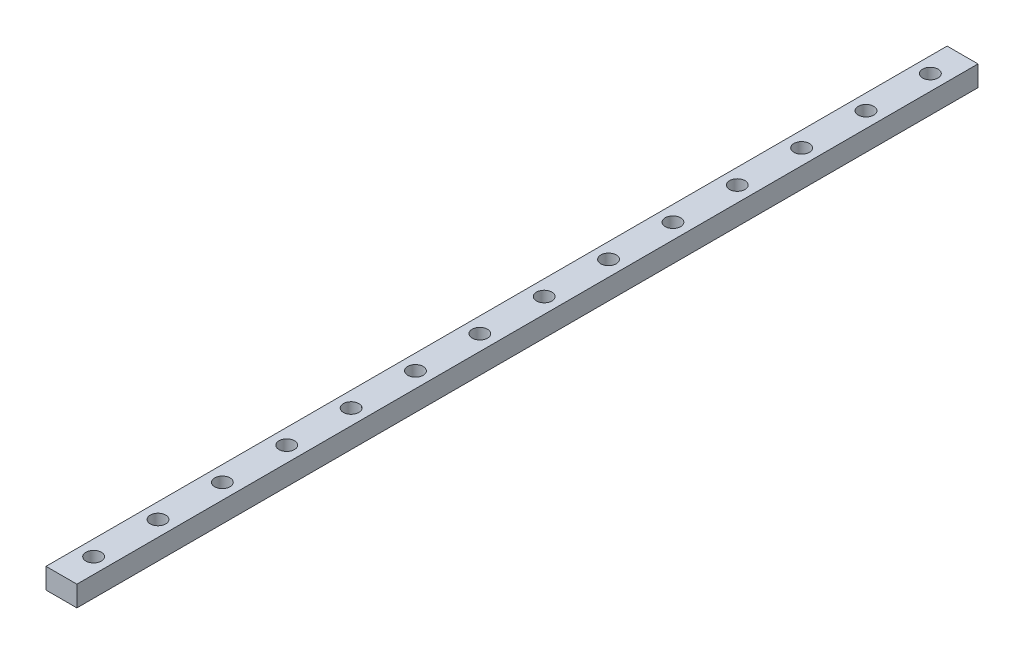
ISO-10303-21;
HEADER;
FILE_DESCRIPTION(('STEP AP214'),'2;1');
FILE_NAME('part.step','',(''),(''),'','','');
FILE_SCHEMA(('AUTOMOTIVE_DESIGN { 1 0 10303 214 1 1 1 1 }'));
ENDSEC;
DATA;
#1=APPLICATION_CONTEXT('core data for automotive mechanical design processes');
#2=APPLICATION_PROTOCOL_DEFINITION('international standard','automotive_design',2000,#1);
#3=PRODUCT_CONTEXT('',#1,'mechanical');
#4=PRODUCT('Part','Part','',(#3));
#5=PRODUCT_RELATED_PRODUCT_CATEGORY('part','',(#4));
#6=PRODUCT_DEFINITION_FORMATION('','',#4);
#7=PRODUCT_DEFINITION_CONTEXT('part definition',#1,'design');
#8=PRODUCT_DEFINITION('design','',#6,#7);
#9=PRODUCT_DEFINITION_SHAPE('','',#8);
#10=(LENGTH_UNIT() NAMED_UNIT(*) SI_UNIT(.MILLI.,.METRE.));
#11=(NAMED_UNIT(*) PLANE_ANGLE_UNIT() SI_UNIT($,.RADIAN.));
#12=(NAMED_UNIT(*) SI_UNIT($,.STERADIAN.) SOLID_ANGLE_UNIT());
#13=UNCERTAINTY_MEASURE_WITH_UNIT(LENGTH_MEASURE(1.E-05),#10,'distance_accuracy_value','');
#14=(GEOMETRIC_REPRESENTATION_CONTEXT(3) GLOBAL_UNCERTAINTY_ASSIGNED_CONTEXT((#13)) GLOBAL_UNIT_ASSIGNED_CONTEXT((#10,
#11,#12)) REPRESENTATION_CONTEXT('',''));
#15=CARTESIAN_POINT('',(0.,0.,0.));
#16=DIRECTION('',(0.,0.,1.));
#17=DIRECTION('',(1.,0.,0.));
#18=AXIS2_PLACEMENT_3D('',#15,#16,#17);
#19=CARTESIAN_POINT('',(0.,0.,350.));
#20=DIRECTION('',(1.,0.,0.));
#21=DIRECTION('',(0.,1.,0.));
#22=AXIS2_PLACEMENT_3D('',#19,#20,#21);
#23=PLANE('',#22);
#24=DIRECTION('',(0.,-1.,0.));
#25=VECTOR('',#24,1.);
#26=CARTESIAN_POINT('',(0.,0.,0.));
#27=LINE('',#26,#25);
#28=CARTESIAN_POINT('',(0.,8.,0.));
#29=VERTEX_POINT('',#28);
#30=CARTESIAN_POINT('',(0.,0.,0.));
#31=VERTEX_POINT('',#30);
#32=EDGE_CURVE('E107',#29,#31,#27,.T.);
#33=ORIENTED_EDGE('',*,*,#32,.T.);
#34=DIRECTION('',(0.,0.,-1.));
#35=VECTOR('',#34,1.);
#36=CARTESIAN_POINT('',(0.,0.,350.));
#37=LINE('',#36,#35);
#38=CARTESIAN_POINT('',(0.,0.,350.));
#39=VERTEX_POINT('',#38);
#40=EDGE_CURVE('E11',#39,#31,#37,.T.);
#41=ORIENTED_EDGE('',*,*,#40,.F.);
#42=DIRECTION('',(0.,-1.,0.));
#43=VECTOR('',#42,1.);
#44=CARTESIAN_POINT('',(0.,0.,350.));
#45=LINE('',#44,#43);
#46=CARTESIAN_POINT('',(0.,8.,350.));
#47=VERTEX_POINT('',#46);
#48=EDGE_CURVE('E94',#47,#39,#45,.T.);
#49=ORIENTED_EDGE('',*,*,#48,.F.);
#50=DIRECTION('',(0.,0.,-1.));
#51=VECTOR('',#50,1.);
#52=CARTESIAN_POINT('',(0.,8.,350.));
#53=LINE('',#52,#51);
#54=EDGE_CURVE('E103',#47,#29,#53,.T.);
#55=ORIENTED_EDGE('',*,*,#54,.T.);
#56=EDGE_LOOP('',(#33,#41,#49,#55));
#57=FACE_BOUND('',#56,.T.);
#58=ADVANCED_FACE('F41',(#57),#23,.F.);
#59=CARTESIAN_POINT('',(0.,0.,350.));
#60=DIRECTION('',(0.,1.,0.));
#61=DIRECTION('',(0.,0.,1.));
#62=AXIS2_PLACEMENT_3D('',#59,#60,#61);
#63=PLANE('',#62);
#64=CARTESIAN_POINT('',(6.,0.,37.5));
#65=DIRECTION('',(0.,-1.,0.));
#66=DIRECTION('',(0.,0.,-1.));
#67=AXIS2_PLACEMENT_3D('',#64,#65,#66);
#68=CIRCLE('',#67,1.75);
#69=CARTESIAN_POINT('',(6.,0.,35.75));
#70=VERTEX_POINT('',#69);
#71=EDGE_CURVE('E125',#70,#70,#68,.T.);
#72=ORIENTED_EDGE('',*,*,#71,.F.);
#73=EDGE_LOOP('',(#72));
#74=FACE_BOUND('',#73,.T.);
#75=CARTESIAN_POINT('',(6.,0.,62.5));
#76=DIRECTION('',(0.,-1.,0.));
#77=DIRECTION('',(0.,0.,-1.));
#78=AXIS2_PLACEMENT_3D('',#75,#76,#77);
#79=CIRCLE('',#78,1.75);
#80=CARTESIAN_POINT('',(6.,0.,60.75));
#81=VERTEX_POINT('',#80);
#82=EDGE_CURVE('E378',#81,#81,#79,.T.);
#83=ORIENTED_EDGE('',*,*,#82,.F.);
#84=EDGE_LOOP('',(#83));
#85=FACE_BOUND('',#84,.T.);
#86=CARTESIAN_POINT('',(6.,0.,87.5));
#87=DIRECTION('',(0.,-1.,0.));
#88=DIRECTION('',(0.,0.,-1.));
#89=AXIS2_PLACEMENT_3D('',#86,#87,#88);
#90=CIRCLE('',#89,1.75);
#91=CARTESIAN_POINT('',(6.,0.,85.75));
#92=VERTEX_POINT('',#91);
#93=EDGE_CURVE('E381',#92,#92,#90,.T.);
#94=ORIENTED_EDGE('',*,*,#93,.F.);
#95=EDGE_LOOP('',(#94));
#96=FACE_BOUND('',#95,.T.);
#97=CARTESIAN_POINT('',(6.,0.,112.5));
#98=DIRECTION('',(0.,-1.,0.));
#99=DIRECTION('',(0.,0.,-1.));
#100=AXIS2_PLACEMENT_3D('',#97,#98,#99);
#101=CIRCLE('',#100,1.75);
#102=CARTESIAN_POINT('',(6.,0.,110.75));
#103=VERTEX_POINT('',#102);
#104=EDGE_CURVE('E386',#103,#103,#101,.T.);
#105=ORIENTED_EDGE('',*,*,#104,.F.);
#106=EDGE_LOOP('',(#105));
#107=FACE_BOUND('',#106,.T.);
#108=CARTESIAN_POINT('',(6.,0.,137.5));
#109=DIRECTION('',(0.,-1.,0.));
#110=DIRECTION('',(0.,0.,-1.));
#111=AXIS2_PLACEMENT_3D('',#108,#109,#110);
#112=CIRCLE('',#111,1.75);
#113=CARTESIAN_POINT('',(6.,0.,135.75));
#114=VERTEX_POINT('',#113);
#115=EDGE_CURVE('E389',#114,#114,#112,.T.);
#116=ORIENTED_EDGE('',*,*,#115,.F.);
#117=EDGE_LOOP('',(#116));
#118=FACE_BOUND('',#117,.T.);
#119=CARTESIAN_POINT('',(6.,0.,162.5));
#120=DIRECTION('',(0.,-1.,0.));
#121=DIRECTION('',(0.,0.,-1.));
#122=AXIS2_PLACEMENT_3D('',#119,#120,#121);
#123=CIRCLE('',#122,1.75);
#124=CARTESIAN_POINT('',(6.,0.,160.75));
#125=VERTEX_POINT('',#124);
#126=EDGE_CURVE('E392',#125,#125,#123,.T.);
#127=ORIENTED_EDGE('',*,*,#126,.F.);
#128=EDGE_LOOP('',(#127));
#129=FACE_BOUND('',#128,.T.);
#130=CARTESIAN_POINT('',(6.,0.,187.5));
#131=DIRECTION('',(0.,-1.,0.));
#132=DIRECTION('',(0.,0.,-1.));
#133=AXIS2_PLACEMENT_3D('',#130,#131,#132);
#134=CIRCLE('',#133,1.75);
#135=CARTESIAN_POINT('',(6.,0.,185.75));
#136=VERTEX_POINT('',#135);
#137=EDGE_CURVE('E395',#136,#136,#134,.T.);
#138=ORIENTED_EDGE('',*,*,#137,.F.);
#139=EDGE_LOOP('',(#138));
#140=FACE_BOUND('',#139,.T.);
#141=CARTESIAN_POINT('',(6.,0.,212.5));
#142=DIRECTION('',(0.,-1.,0.));
#143=DIRECTION('',(0.,0.,-1.));
#144=AXIS2_PLACEMENT_3D('',#141,#142,#143);
#145=CIRCLE('',#144,1.75);
#146=CARTESIAN_POINT('',(6.,0.,210.75));
#147=VERTEX_POINT('',#146);
#148=EDGE_CURVE('E398',#147,#147,#145,.T.);
#149=ORIENTED_EDGE('',*,*,#148,.F.);
#150=EDGE_LOOP('',(#149));
#151=FACE_BOUND('',#150,.T.);
#152=CARTESIAN_POINT('',(6.,0.,237.5));
#153=DIRECTION('',(0.,-1.,0.));
#154=DIRECTION('',(0.,0.,-1.));
#155=AXIS2_PLACEMENT_3D('',#152,#153,#154);
#156=CIRCLE('',#155,1.75);
#157=CARTESIAN_POINT('',(6.,0.,235.75));
#158=VERTEX_POINT('',#157);
#159=EDGE_CURVE('E401',#158,#158,#156,.T.);
#160=ORIENTED_EDGE('',*,*,#159,.F.);
#161=EDGE_LOOP('',(#160));
#162=FACE_BOUND('',#161,.T.);
#163=CARTESIAN_POINT('',(6.,0.,262.5));
#164=DIRECTION('',(0.,-1.,0.));
#165=DIRECTION('',(0.,0.,-1.));
#166=AXIS2_PLACEMENT_3D('',#163,#164,#165);
#167=CIRCLE('',#166,1.75);
#168=CARTESIAN_POINT('',(6.,0.,260.75));
#169=VERTEX_POINT('',#168);
#170=EDGE_CURVE('E404',#169,#169,#167,.T.);
#171=ORIENTED_EDGE('',*,*,#170,.F.);
#172=EDGE_LOOP('',(#171));
#173=FACE_BOUND('',#172,.T.);
#174=CARTESIAN_POINT('',(6.,0.,287.5));
#175=DIRECTION('',(0.,-1.,0.));
#176=DIRECTION('',(0.,0.,-1.));
#177=AXIS2_PLACEMENT_3D('',#174,#175,#176);
#178=CIRCLE('',#177,1.75);
#179=CARTESIAN_POINT('',(6.,0.,285.75));
#180=VERTEX_POINT('',#179);
#181=EDGE_CURVE('E407',#180,#180,#178,.T.);
#182=ORIENTED_EDGE('',*,*,#181,.F.);
#183=EDGE_LOOP('',(#182));
#184=FACE_BOUND('',#183,.T.);
#185=CARTESIAN_POINT('',(6.,0.,312.5));
#186=DIRECTION('',(0.,-1.,0.));
#187=DIRECTION('',(0.,0.,-1.));
#188=AXIS2_PLACEMENT_3D('',#185,#186,#187);
#189=CIRCLE('',#188,1.75);
#190=CARTESIAN_POINT('',(6.,0.,310.75));
#191=VERTEX_POINT('',#190);
#192=EDGE_CURVE('E410',#191,#191,#189,.T.);
#193=ORIENTED_EDGE('',*,*,#192,.F.);
#194=EDGE_LOOP('',(#193));
#195=FACE_BOUND('',#194,.T.);
#196=CARTESIAN_POINT('',(6.,0.,337.5));
#197=DIRECTION('',(0.,-1.,0.));
#198=DIRECTION('',(0.,0.,-1.));
#199=AXIS2_PLACEMENT_3D('',#196,#197,#198);
#200=CIRCLE('',#199,1.75);
#201=CARTESIAN_POINT('',(6.,0.,335.75));
#202=VERTEX_POINT('',#201);
#203=EDGE_CURVE('E413',#202,#202,#200,.T.);
#204=ORIENTED_EDGE('',*,*,#203,.F.);
#205=EDGE_LOOP('',(#204));
#206=FACE_BOUND('',#205,.T.);
#207=CARTESIAN_POINT('',(6.,0.,12.5));
#208=DIRECTION('',(0.,-1.,0.));
#209=DIRECTION('',(0.,0.,-1.));
#210=AXIS2_PLACEMENT_3D('',#207,#208,#209);
#211=CIRCLE('',#210,1.75);
#212=CARTESIAN_POINT('',(6.,0.,10.75));
#213=VERTEX_POINT('',#212);
#214=EDGE_CURVE('E120',#213,#213,#211,.T.);
#215=ORIENTED_EDGE('',*,*,#214,.F.);
#216=EDGE_LOOP('',(#215));
#217=FACE_BOUND('',#216,.T.);
#218=DIRECTION('',(1.,0.,0.));
#219=VECTOR('',#218,1.);
#220=CARTESIAN_POINT('',(0.,0.,0.));
#221=LINE('',#220,#219);
#222=CARTESIAN_POINT('',(12.,0.,0.));
#223=VERTEX_POINT('',#222);
#224=EDGE_CURVE('E98',#31,#223,#221,.T.);
#225=ORIENTED_EDGE('',*,*,#224,.T.);
#226=DIRECTION('',(0.,0.,-1.));
#227=VECTOR('',#226,1.);
#228=CARTESIAN_POINT('',(12.,0.,350.));
#229=LINE('',#228,#227);
#230=CARTESIAN_POINT('',(12.,0.,350.));
#231=VERTEX_POINT('',#230);
#232=EDGE_CURVE('E50',#231,#223,#229,.T.);
#233=ORIENTED_EDGE('',*,*,#232,.F.);
#234=DIRECTION('',(1.,0.,0.));
#235=VECTOR('',#234,1.);
#236=CARTESIAN_POINT('',(0.,0.,350.));
#237=LINE('',#236,#235);
#238=EDGE_CURVE('E89',#39,#231,#237,.T.);
#239=ORIENTED_EDGE('',*,*,#238,.F.);
#240=ORIENTED_EDGE('',*,*,#40,.T.);
#241=EDGE_LOOP('',(#225,#233,#239,#240));
#242=FACE_BOUND('',#241,.T.);
#243=ADVANCED_FACE('F97',(#74,#85,#96,#107,#118,#129,#140,#151,#162,#173,#184,#195,#206,#217,
#242),#63,.F.);
#244=CARTESIAN_POINT('',(12.,0.,350.));
#245=DIRECTION('',(-1.,0.,0.));
#246=DIRECTION('',(0.,-1.,0.));
#247=AXIS2_PLACEMENT_3D('',#244,#245,#246);
#248=PLANE('',#247);
#249=DIRECTION('',(0.,1.,0.));
#250=VECTOR('',#249,1.);
#251=CARTESIAN_POINT('',(12.,0.,0.));
#252=LINE('',#251,#250);
#253=CARTESIAN_POINT('',(12.,8.,0.));
#254=VERTEX_POINT('',#253);
#255=EDGE_CURVE('E76',#223,#254,#252,.T.);
#256=ORIENTED_EDGE('',*,*,#255,.T.);
#257=DIRECTION('',(0.,0.,-1.));
#258=VECTOR('',#257,1.);
#259=CARTESIAN_POINT('',(12.,8.,350.));
#260=LINE('',#259,#258);
#261=CARTESIAN_POINT('',(12.,8.,350.));
#262=VERTEX_POINT('',#261);
#263=EDGE_CURVE('E99',#262,#254,#260,.T.);
#264=ORIENTED_EDGE('',*,*,#263,.F.);
#265=DIRECTION('',(0.,1.,0.));
#266=VECTOR('',#265,1.);
#267=CARTESIAN_POINT('',(12.,0.,350.));
#268=LINE('',#267,#266);
#269=EDGE_CURVE('E92',#231,#262,#268,.T.);
#270=ORIENTED_EDGE('',*,*,#269,.F.);
#271=ORIENTED_EDGE('',*,*,#232,.T.);
#272=EDGE_LOOP('',(#256,#264,#270,#271));
#273=FACE_BOUND('',#272,.T.);
#274=ADVANCED_FACE('F101',(#273),#248,.F.);
#275=CARTESIAN_POINT('',(0.,8.,350.));
#276=DIRECTION('',(0.,-1.,0.));
#277=DIRECTION('',(0.,0.,-1.));
#278=AXIS2_PLACEMENT_3D('',#275,#276,#277);
#279=PLANE('',#278);
#280=CARTESIAN_POINT('',(6.,8.,37.5));
#281=DIRECTION('',(0.,1.,0.));
#282=DIRECTION('',(0.,0.,1.));
#283=AXIS2_PLACEMENT_3D('',#280,#281,#282);
#284=CIRCLE('',#283,3.);
#285=CARTESIAN_POINT('',(6.,8.,40.5));
#286=VERTEX_POINT('',#285);
#287=EDGE_CURVE('E418',#286,#286,#284,.T.);
#288=ORIENTED_EDGE('',*,*,#287,.F.);
#289=EDGE_LOOP('',(#288));
#290=FACE_BOUND('',#289,.T.);
#291=CARTESIAN_POINT('',(6.,8.,62.5));
#292=DIRECTION('',(0.,1.,0.));
#293=DIRECTION('',(0.,0.,1.));
#294=AXIS2_PLACEMENT_3D('',#291,#292,#293);
#295=CIRCLE('',#294,3.);
#296=CARTESIAN_POINT('',(6.,8.,65.5));
#297=VERTEX_POINT('',#296);
#298=EDGE_CURVE('E424',#297,#297,#295,.T.);
#299=ORIENTED_EDGE('',*,*,#298,.F.);
#300=EDGE_LOOP('',(#299));
#301=FACE_BOUND('',#300,.T.);
#302=CARTESIAN_POINT('',(6.,8.,87.5));
#303=DIRECTION('',(0.,1.,0.));
#304=DIRECTION('',(0.,0.,1.));
#305=AXIS2_PLACEMENT_3D('',#302,#303,#304);
#306=CIRCLE('',#305,3.);
#307=CARTESIAN_POINT('',(6.,8.,90.5));
#308=VERTEX_POINT('',#307);
#309=EDGE_CURVE('E430',#308,#308,#306,.T.);
#310=ORIENTED_EDGE('',*,*,#309,.F.);
#311=EDGE_LOOP('',(#310));
#312=FACE_BOUND('',#311,.T.);
#313=CARTESIAN_POINT('',(6.,8.,112.5));
#314=DIRECTION('',(0.,1.,0.));
#315=DIRECTION('',(0.,0.,1.));
#316=AXIS2_PLACEMENT_3D('',#313,#314,#315);
#317=CIRCLE('',#316,3.);
#318=CARTESIAN_POINT('',(6.,8.,115.5));
#319=VERTEX_POINT('',#318);
#320=EDGE_CURVE('E436',#319,#319,#317,.T.);
#321=ORIENTED_EDGE('',*,*,#320,.F.);
#322=EDGE_LOOP('',(#321));
#323=FACE_BOUND('',#322,.T.);
#324=CARTESIAN_POINT('',(6.,8.,137.5));
#325=DIRECTION('',(0.,1.,0.));
#326=DIRECTION('',(0.,0.,1.));
#327=AXIS2_PLACEMENT_3D('',#324,#325,#326);
#328=CIRCLE('',#327,3.);
#329=CARTESIAN_POINT('',(6.,8.,140.5));
#330=VERTEX_POINT('',#329);
#331=EDGE_CURVE('E442',#330,#330,#328,.T.);
#332=ORIENTED_EDGE('',*,*,#331,.F.);
#333=EDGE_LOOP('',(#332));
#334=FACE_BOUND('',#333,.T.);
#335=CARTESIAN_POINT('',(6.,8.,162.5));
#336=DIRECTION('',(0.,1.,0.));
#337=DIRECTION('',(0.,0.,1.));
#338=AXIS2_PLACEMENT_3D('',#335,#336,#337);
#339=CIRCLE('',#338,3.);
#340=CARTESIAN_POINT('',(6.,8.,165.5));
#341=VERTEX_POINT('',#340);
#342=EDGE_CURVE('E448',#341,#341,#339,.T.);
#343=ORIENTED_EDGE('',*,*,#342,.F.);
#344=EDGE_LOOP('',(#343));
#345=FACE_BOUND('',#344,.T.);
#346=CARTESIAN_POINT('',(6.,8.,187.5));
#347=DIRECTION('',(0.,1.,0.));
#348=DIRECTION('',(0.,0.,1.));
#349=AXIS2_PLACEMENT_3D('',#346,#347,#348);
#350=CIRCLE('',#349,3.);
#351=CARTESIAN_POINT('',(6.,8.,190.5));
#352=VERTEX_POINT('',#351);
#353=EDGE_CURVE('E454',#352,#352,#350,.T.);
#354=ORIENTED_EDGE('',*,*,#353,.F.);
#355=EDGE_LOOP('',(#354));
#356=FACE_BOUND('',#355,.T.);
#357=CARTESIAN_POINT('',(6.,8.,212.5));
#358=DIRECTION('',(0.,1.,0.));
#359=DIRECTION('',(0.,0.,1.));
#360=AXIS2_PLACEMENT_3D('',#357,#358,#359);
#361=CIRCLE('',#360,3.);
#362=CARTESIAN_POINT('',(6.,8.,215.5));
#363=VERTEX_POINT('',#362);
#364=EDGE_CURVE('E460',#363,#363,#361,.T.);
#365=ORIENTED_EDGE('',*,*,#364,.F.);
#366=EDGE_LOOP('',(#365));
#367=FACE_BOUND('',#366,.T.);
#368=CARTESIAN_POINT('',(6.,8.,237.5));
#369=DIRECTION('',(0.,1.,0.));
#370=DIRECTION('',(0.,0.,1.));
#371=AXIS2_PLACEMENT_3D('',#368,#369,#370);
#372=CIRCLE('',#371,3.);
#373=CARTESIAN_POINT('',(6.,8.,240.5));
#374=VERTEX_POINT('',#373);
#375=EDGE_CURVE('E466',#374,#374,#372,.T.);
#376=ORIENTED_EDGE('',*,*,#375,.F.);
#377=EDGE_LOOP('',(#376));
#378=FACE_BOUND('',#377,.T.);
#379=CARTESIAN_POINT('',(6.,8.,262.5));
#380=DIRECTION('',(0.,1.,0.));
#381=DIRECTION('',(0.,0.,1.));
#382=AXIS2_PLACEMENT_3D('',#379,#380,#381);
#383=CIRCLE('',#382,3.);
#384=CARTESIAN_POINT('',(6.,8.,265.5));
#385=VERTEX_POINT('',#384);
#386=EDGE_CURVE('E472',#385,#385,#383,.T.);
#387=ORIENTED_EDGE('',*,*,#386,.F.);
#388=EDGE_LOOP('',(#387));
#389=FACE_BOUND('',#388,.T.);
#390=CARTESIAN_POINT('',(6.,8.,287.5));
#391=DIRECTION('',(0.,1.,0.));
#392=DIRECTION('',(0.,0.,1.));
#393=AXIS2_PLACEMENT_3D('',#390,#391,#392);
#394=CIRCLE('',#393,3.);
#395=CARTESIAN_POINT('',(6.,8.,290.5));
#396=VERTEX_POINT('',#395);
#397=EDGE_CURVE('E478',#396,#396,#394,.T.);
#398=ORIENTED_EDGE('',*,*,#397,.F.);
#399=EDGE_LOOP('',(#398));
#400=FACE_BOUND('',#399,.T.);
#401=CARTESIAN_POINT('',(6.,8.,312.5));
#402=DIRECTION('',(0.,1.,0.));
#403=DIRECTION('',(0.,0.,1.));
#404=AXIS2_PLACEMENT_3D('',#401,#402,#403);
#405=CIRCLE('',#404,3.);
#406=CARTESIAN_POINT('',(6.,8.,315.5));
#407=VERTEX_POINT('',#406);
#408=EDGE_CURVE('E168',#407,#407,#405,.T.);
#409=ORIENTED_EDGE('',*,*,#408,.F.);
#410=EDGE_LOOP('',(#409));
#411=FACE_BOUND('',#410,.T.);
#412=CARTESIAN_POINT('',(6.,8.,337.5));
#413=DIRECTION('',(0.,1.,0.));
#414=DIRECTION('',(0.,0.,1.));
#415=AXIS2_PLACEMENT_3D('',#412,#413,#414);
#416=CIRCLE('',#415,3.);
#417=CARTESIAN_POINT('',(6.,8.,340.5));
#418=VERTEX_POINT('',#417);
#419=EDGE_CURVE('E159',#418,#418,#416,.T.);
#420=ORIENTED_EDGE('',*,*,#419,.F.);
#421=EDGE_LOOP('',(#420));
#422=FACE_BOUND('',#421,.T.);
#423=CARTESIAN_POINT('',(6.,8.,12.5));
#424=DIRECTION('',(0.,1.,0.));
#425=DIRECTION('',(0.,0.,1.));
#426=AXIS2_PLACEMENT_3D('',#423,#424,#425);
#427=CIRCLE('',#426,3.);
#428=CARTESIAN_POINT('',(6.,8.,15.5));
#429=VERTEX_POINT('',#428);
#430=EDGE_CURVE('E119',#429,#429,#427,.T.);
#431=ORIENTED_EDGE('',*,*,#430,.F.);
#432=EDGE_LOOP('',(#431));
#433=FACE_BOUND('',#432,.T.);
#434=DIRECTION('',(-1.,0.,0.));
#435=VECTOR('',#434,1.);
#436=CARTESIAN_POINT('',(0.,8.,0.));
#437=LINE('',#436,#435);
#438=EDGE_CURVE('E82',#254,#29,#437,.T.);
#439=ORIENTED_EDGE('',*,*,#438,.T.);
#440=ORIENTED_EDGE('',*,*,#54,.F.);
#441=DIRECTION('',(-1.,0.,0.));
#442=VECTOR('',#441,1.);
#443=CARTESIAN_POINT('',(0.,8.,350.));
#444=LINE('',#443,#442);
#445=EDGE_CURVE('E59',#262,#47,#444,.T.);
#446=ORIENTED_EDGE('',*,*,#445,.F.);
#447=ORIENTED_EDGE('',*,*,#263,.T.);
#448=EDGE_LOOP('',(#439,#440,#446,#447));
#449=FACE_BOUND('',#448,.T.);
#450=ADVANCED_FACE('F182',(#290,#301,#312,#323,#334,#345,#356,#367,#378,#389,#400,#411,#422,
#433,#449),#279,.F.);
#451=CARTESIAN_POINT('',(0.,0.,350.));
#452=DIRECTION('',(0.,0.,-1.));
#453=DIRECTION('',(-1.,0.,0.));
#454=AXIS2_PLACEMENT_3D('',#451,#452,#453);
#455=PLANE('',#454);
#456=ORIENTED_EDGE('',*,*,#48,.T.);
#457=ORIENTED_EDGE('',*,*,#238,.T.);
#458=ORIENTED_EDGE('',*,*,#269,.T.);
#459=ORIENTED_EDGE('',*,*,#445,.T.);
#460=EDGE_LOOP('',(#456,#457,#458,#459));
#461=FACE_BOUND('',#460,.T.);
#462=ADVANCED_FACE('F90',(#461),#455,.F.);
#463=CARTESIAN_POINT('',(0.,0.,0.));
#464=DIRECTION('',(0.,0.,-1.));
#465=DIRECTION('',(-1.,0.,0.));
#466=AXIS2_PLACEMENT_3D('',#463,#464,#465);
#467=PLANE('',#466);
#468=ORIENTED_EDGE('',*,*,#32,.F.);
#469=ORIENTED_EDGE('',*,*,#438,.F.);
#470=ORIENTED_EDGE('',*,*,#255,.F.);
#471=ORIENTED_EDGE('',*,*,#224,.F.);
#472=EDGE_LOOP('',(#468,#469,#470,#471));
#473=FACE_BOUND('',#472,.T.);
#474=ADVANCED_FACE('F191',(#473),#467,.T.);
#475=CARTESIAN_POINT('',(6.,3.5,12.5));
#476=DIRECTION('',(0.,1.,0.));
#477=DIRECTION('',(0.,0.,1.));
#478=AXIS2_PLACEMENT_3D('',#475,#476,#477);
#479=CYLINDRICAL_SURFACE('',#478,3.);
#480=CARTESIAN_POINT('',(6.,3.5,12.5));
#481=DIRECTION('',(0.,1.,0.));
#482=DIRECTION('',(0.,0.,1.));
#483=AXIS2_PLACEMENT_3D('',#480,#481,#482);
#484=CIRCLE('',#483,3.);
#485=CARTESIAN_POINT('',(6.,3.5,15.5));
#486=VERTEX_POINT('',#485);
#487=EDGE_CURVE('E110',#486,#486,#484,.T.);
#488=ORIENTED_EDGE('',*,*,#487,.F.);
#489=EDGE_LOOP('',(#488));
#490=FACE_BOUND('',#489,.T.);
#491=ORIENTED_EDGE('',*,*,#430,.T.);
#492=EDGE_LOOP('',(#491));
#493=FACE_BOUND('',#492,.T.);
#494=ADVANCED_FACE('F180',(#490,#493),#479,.F.);
#495=CARTESIAN_POINT('',(6.,3.5,12.5));
#496=DIRECTION('',(0.,1.,0.));
#497=DIRECTION('',(0.,0.,1.));
#498=AXIS2_PLACEMENT_3D('',#495,#496,#497);
#499=PLANE('',#498);
#500=CARTESIAN_POINT('',(6.,3.5,12.5));
#501=DIRECTION('',(0.,1.,0.));
#502=DIRECTION('',(0.,0.,1.));
#503=AXIS2_PLACEMENT_3D('',#500,#501,#502);
#504=CIRCLE('',#503,1.75);
#505=CARTESIAN_POINT('',(6.,3.5,14.25));
#506=VERTEX_POINT('',#505);
#507=EDGE_CURVE('E116',#506,#506,#504,.T.);
#508=ORIENTED_EDGE('',*,*,#507,.F.);
#509=EDGE_LOOP('',(#508));
#510=FACE_BOUND('',#509,.T.);
#511=ORIENTED_EDGE('',*,*,#487,.T.);
#512=EDGE_LOOP('',(#511));
#513=FACE_BOUND('',#512,.T.);
#514=ADVANCED_FACE('F209',(#510,#513),#499,.T.);
#515=CARTESIAN_POINT('',(6.,8.,12.5));
#516=DIRECTION('',(0.,-1.,0.));
#517=DIRECTION('',(0.,0.,-1.));
#518=AXIS2_PLACEMENT_3D('',#515,#516,#517);
#519=CYLINDRICAL_SURFACE('',#518,1.75);
#520=ORIENTED_EDGE('',*,*,#507,.T.);
#521=EDGE_LOOP('',(#520));
#522=FACE_BOUND('',#521,.T.);
#523=ORIENTED_EDGE('',*,*,#214,.T.);
#524=EDGE_LOOP('',(#523));
#525=FACE_BOUND('',#524,.T.);
#526=ADVANCED_FACE('F215',(#522,#525),#519,.F.);
#527=CARTESIAN_POINT('',(6.,3.5,337.5));
#528=DIRECTION('',(0.,1.,0.));
#529=DIRECTION('',(0.,0.,1.));
#530=AXIS2_PLACEMENT_3D('',#527,#528,#529);
#531=CYLINDRICAL_SURFACE('',#530,3.);
#532=CARTESIAN_POINT('',(6.,3.5,337.5));
#533=DIRECTION('',(0.,1.,0.));
#534=DIRECTION('',(0.,0.,1.));
#535=AXIS2_PLACEMENT_3D('',#532,#533,#534);
#536=CIRCLE('',#535,3.);
#537=CARTESIAN_POINT('',(6.,3.5,340.5));
#538=VERTEX_POINT('',#537);
#539=EDGE_CURVE('E163',#538,#538,#536,.T.);
#540=ORIENTED_EDGE('',*,*,#539,.F.);
#541=EDGE_LOOP('',(#540));
#542=FACE_BOUND('',#541,.T.);
#543=ORIENTED_EDGE('',*,*,#419,.T.);
#544=EDGE_LOOP('',(#543));
#545=FACE_BOUND('',#544,.T.);
#546=ADVANCED_FACE('F219',(#542,#545),#531,.F.);
#547=CARTESIAN_POINT('',(6.,3.5,337.5));
#548=DIRECTION('',(0.,1.,0.));
#549=DIRECTION('',(0.,0.,1.));
#550=AXIS2_PLACEMENT_3D('',#547,#548,#549);
#551=PLANE('',#550);
#552=CARTESIAN_POINT('',(6.,3.5,337.5));
#553=DIRECTION('',(0.,1.,0.));
#554=DIRECTION('',(0.,0.,1.));
#555=AXIS2_PLACEMENT_3D('',#552,#553,#554);
#556=CIRCLE('',#555,1.75);
#557=CARTESIAN_POINT('',(6.,3.5,339.25));
#558=VERTEX_POINT('',#557);
#559=EDGE_CURVE('E44',#558,#558,#556,.T.);
#560=ORIENTED_EDGE('',*,*,#559,.F.);
#561=EDGE_LOOP('',(#560));
#562=FACE_BOUND('',#561,.T.);
#563=ORIENTED_EDGE('',*,*,#539,.T.);
#564=EDGE_LOOP('',(#563));
#565=FACE_BOUND('',#564,.T.);
#566=ADVANCED_FACE('F222',(#562,#565),#551,.T.);
#567=CARTESIAN_POINT('',(6.,3.5,312.5));
#568=DIRECTION('',(0.,1.,0.));
#569=DIRECTION('',(0.,0.,1.));
#570=AXIS2_PLACEMENT_3D('',#567,#568,#569);
#571=CYLINDRICAL_SURFACE('',#570,3.);
#572=CARTESIAN_POINT('',(6.,3.5,312.5));
#573=DIRECTION('',(0.,1.,0.));
#574=DIRECTION('',(0.,0.,1.));
#575=AXIS2_PLACEMENT_3D('',#572,#573,#574);
#576=CIRCLE('',#575,3.);
#577=CARTESIAN_POINT('',(6.,3.5,315.5));
#578=VERTEX_POINT('',#577);
#579=EDGE_CURVE('E481',#578,#578,#576,.T.);
#580=ORIENTED_EDGE('',*,*,#579,.F.);
#581=EDGE_LOOP('',(#580));
#582=FACE_BOUND('',#581,.T.);
#583=ORIENTED_EDGE('',*,*,#408,.T.);
#584=EDGE_LOOP('',(#583));
#585=FACE_BOUND('',#584,.T.);
#586=ADVANCED_FACE('F226',(#582,#585),#571,.F.);
#587=CARTESIAN_POINT('',(6.,3.5,312.5));
#588=DIRECTION('',(0.,1.,0.));
#589=DIRECTION('',(0.,0.,1.));
#590=AXIS2_PLACEMENT_3D('',#587,#588,#589);
#591=PLANE('',#590);
#592=CARTESIAN_POINT('',(6.,3.5,312.5));
#593=DIRECTION('',(0.,1.,0.));
#594=DIRECTION('',(0.,0.,1.));
#595=AXIS2_PLACEMENT_3D('',#592,#593,#594);
#596=CIRCLE('',#595,1.75);
#597=CARTESIAN_POINT('',(6.,3.5,314.25));
#598=VERTEX_POINT('',#597);
#599=EDGE_CURVE('E154',#598,#598,#596,.T.);
#600=ORIENTED_EDGE('',*,*,#599,.F.);
#601=EDGE_LOOP('',(#600));
#602=FACE_BOUND('',#601,.T.);
#603=ORIENTED_EDGE('',*,*,#579,.T.);
#604=EDGE_LOOP('',(#603));
#605=FACE_BOUND('',#604,.T.);
#606=ADVANCED_FACE('F230',(#602,#605),#591,.T.);
#607=CARTESIAN_POINT('',(6.,3.5,287.5));
#608=DIRECTION('',(0.,1.,0.));
#609=DIRECTION('',(0.,0.,1.));
#610=AXIS2_PLACEMENT_3D('',#607,#608,#609);
#611=CYLINDRICAL_SURFACE('',#610,3.);
#612=CARTESIAN_POINT('',(6.,3.5,287.5));
#613=DIRECTION('',(0.,1.,0.));
#614=DIRECTION('',(0.,0.,1.));
#615=AXIS2_PLACEMENT_3D('',#612,#613,#614);
#616=CIRCLE('',#615,3.);
#617=CARTESIAN_POINT('',(6.,3.5,290.5));
#618=VERTEX_POINT('',#617);
#619=EDGE_CURVE('E475',#618,#618,#616,.T.);
#620=ORIENTED_EDGE('',*,*,#619,.F.);
#621=EDGE_LOOP('',(#620));
#622=FACE_BOUND('',#621,.T.);
#623=ORIENTED_EDGE('',*,*,#397,.T.);
#624=EDGE_LOOP('',(#623));
#625=FACE_BOUND('',#624,.T.);
#626=ADVANCED_FACE('F234',(#622,#625),#611,.F.);
#627=CARTESIAN_POINT('',(6.,3.5,287.5));
#628=DIRECTION('',(0.,1.,0.));
#629=DIRECTION('',(0.,0.,1.));
#630=AXIS2_PLACEMENT_3D('',#627,#628,#629);
#631=PLANE('',#630);
#632=CARTESIAN_POINT('',(6.,3.5,287.5));
#633=DIRECTION('',(0.,1.,0.));
#634=DIRECTION('',(0.,0.,1.));
#635=AXIS2_PLACEMENT_3D('',#632,#633,#634);
#636=CIRCLE('',#635,1.75);
#637=CARTESIAN_POINT('',(6.,3.5,289.25));
#638=VERTEX_POINT('',#637);
#639=EDGE_CURVE('E152',#638,#638,#636,.T.);
#640=ORIENTED_EDGE('',*,*,#639,.F.);
#641=EDGE_LOOP('',(#640));
#642=FACE_BOUND('',#641,.T.);
#643=ORIENTED_EDGE('',*,*,#619,.T.);
#644=EDGE_LOOP('',(#643));
#645=FACE_BOUND('',#644,.T.);
#646=ADVANCED_FACE('F238',(#642,#645),#631,.T.);
#647=CARTESIAN_POINT('',(6.,3.5,262.5));
#648=DIRECTION('',(0.,1.,0.));
#649=DIRECTION('',(0.,0.,1.));
#650=AXIS2_PLACEMENT_3D('',#647,#648,#649);
#651=CYLINDRICAL_SURFACE('',#650,3.);
#652=CARTESIAN_POINT('',(6.,3.5,262.5));
#653=DIRECTION('',(0.,1.,0.));
#654=DIRECTION('',(0.,0.,1.));
#655=AXIS2_PLACEMENT_3D('',#652,#653,#654);
#656=CIRCLE('',#655,3.);
#657=CARTESIAN_POINT('',(6.,3.5,265.5));
#658=VERTEX_POINT('',#657);
#659=EDGE_CURVE('E469',#658,#658,#656,.T.);
#660=ORIENTED_EDGE('',*,*,#659,.F.);
#661=EDGE_LOOP('',(#660));
#662=FACE_BOUND('',#661,.T.);
#663=ORIENTED_EDGE('',*,*,#386,.T.);
#664=EDGE_LOOP('',(#663));
#665=FACE_BOUND('',#664,.T.);
#666=ADVANCED_FACE('F242',(#662,#665),#651,.F.);
#667=CARTESIAN_POINT('',(6.,3.5,262.5));
#668=DIRECTION('',(0.,1.,0.));
#669=DIRECTION('',(0.,0.,1.));
#670=AXIS2_PLACEMENT_3D('',#667,#668,#669);
#671=PLANE('',#670);
#672=CARTESIAN_POINT('',(6.,3.5,262.5));
#673=DIRECTION('',(0.,1.,0.));
#674=DIRECTION('',(0.,0.,1.));
#675=AXIS2_PLACEMENT_3D('',#672,#673,#674);
#676=CIRCLE('',#675,1.75);
#677=CARTESIAN_POINT('',(6.,3.5,264.25));
#678=VERTEX_POINT('',#677);
#679=EDGE_CURVE('E149',#678,#678,#676,.T.);
#680=ORIENTED_EDGE('',*,*,#679,.F.);
#681=EDGE_LOOP('',(#680));
#682=FACE_BOUND('',#681,.T.);
#683=ORIENTED_EDGE('',*,*,#659,.T.);
#684=EDGE_LOOP('',(#683));
#685=FACE_BOUND('',#684,.T.);
#686=ADVANCED_FACE('F246',(#682,#685),#671,.T.);
#687=CARTESIAN_POINT('',(6.,3.5,237.5));
#688=DIRECTION('',(0.,1.,0.));
#689=DIRECTION('',(0.,0.,1.));
#690=AXIS2_PLACEMENT_3D('',#687,#688,#689);
#691=CYLINDRICAL_SURFACE('',#690,3.);
#692=CARTESIAN_POINT('',(6.,3.5,237.5));
#693=DIRECTION('',(0.,1.,0.));
#694=DIRECTION('',(0.,0.,1.));
#695=AXIS2_PLACEMENT_3D('',#692,#693,#694);
#696=CIRCLE('',#695,3.);
#697=CARTESIAN_POINT('',(6.,3.5,240.5));
#698=VERTEX_POINT('',#697);
#699=EDGE_CURVE('E463',#698,#698,#696,.T.);
#700=ORIENTED_EDGE('',*,*,#699,.F.);
#701=EDGE_LOOP('',(#700));
#702=FACE_BOUND('',#701,.T.);
#703=ORIENTED_EDGE('',*,*,#375,.T.);
#704=EDGE_LOOP('',(#703));
#705=FACE_BOUND('',#704,.T.);
#706=ADVANCED_FACE('F250',(#702,#705),#691,.F.);
#707=CARTESIAN_POINT('',(6.,3.5,237.5));
#708=DIRECTION('',(0.,1.,0.));
#709=DIRECTION('',(0.,0.,1.));
#710=AXIS2_PLACEMENT_3D('',#707,#708,#709);
#711=PLANE('',#710);
#712=CARTESIAN_POINT('',(6.,3.5,237.5));
#713=DIRECTION('',(0.,1.,0.));
#714=DIRECTION('',(0.,0.,1.));
#715=AXIS2_PLACEMENT_3D('',#712,#713,#714);
#716=CIRCLE('',#715,1.75);
#717=CARTESIAN_POINT('',(6.,3.5,239.25));
#718=VERTEX_POINT('',#717);
#719=EDGE_CURVE('E146',#718,#718,#716,.T.);
#720=ORIENTED_EDGE('',*,*,#719,.F.);
#721=EDGE_LOOP('',(#720));
#722=FACE_BOUND('',#721,.T.);
#723=ORIENTED_EDGE('',*,*,#699,.T.);
#724=EDGE_LOOP('',(#723));
#725=FACE_BOUND('',#724,.T.);
#726=ADVANCED_FACE('F254',(#722,#725),#711,.T.);
#727=CARTESIAN_POINT('',(6.,3.5,212.5));
#728=DIRECTION('',(0.,1.,0.));
#729=DIRECTION('',(0.,0.,1.));
#730=AXIS2_PLACEMENT_3D('',#727,#728,#729);
#731=CYLINDRICAL_SURFACE('',#730,3.);
#732=CARTESIAN_POINT('',(6.,3.5,212.5));
#733=DIRECTION('',(0.,1.,0.));
#734=DIRECTION('',(0.,0.,1.));
#735=AXIS2_PLACEMENT_3D('',#732,#733,#734);
#736=CIRCLE('',#735,3.);
#737=CARTESIAN_POINT('',(6.,3.5,215.5));
#738=VERTEX_POINT('',#737);
#739=EDGE_CURVE('E457',#738,#738,#736,.T.);
#740=ORIENTED_EDGE('',*,*,#739,.F.);
#741=EDGE_LOOP('',(#740));
#742=FACE_BOUND('',#741,.T.);
#743=ORIENTED_EDGE('',*,*,#364,.T.);
#744=EDGE_LOOP('',(#743));
#745=FACE_BOUND('',#744,.T.);
#746=ADVANCED_FACE('F258',(#742,#745),#731,.F.);
#747=CARTESIAN_POINT('',(6.,3.5,212.5));
#748=DIRECTION('',(0.,1.,0.));
#749=DIRECTION('',(0.,0.,1.));
#750=AXIS2_PLACEMENT_3D('',#747,#748,#749);
#751=PLANE('',#750);
#752=CARTESIAN_POINT('',(6.,3.5,212.5));
#753=DIRECTION('',(0.,1.,0.));
#754=DIRECTION('',(0.,0.,1.));
#755=AXIS2_PLACEMENT_3D('',#752,#753,#754);
#756=CIRCLE('',#755,1.75);
#757=CARTESIAN_POINT('',(6.,3.5,214.25));
#758=VERTEX_POINT('',#757);
#759=EDGE_CURVE('E143',#758,#758,#756,.T.);
#760=ORIENTED_EDGE('',*,*,#759,.F.);
#761=EDGE_LOOP('',(#760));
#762=FACE_BOUND('',#761,.T.);
#763=ORIENTED_EDGE('',*,*,#739,.T.);
#764=EDGE_LOOP('',(#763));
#765=FACE_BOUND('',#764,.T.);
#766=ADVANCED_FACE('F262',(#762,#765),#751,.T.);
#767=CARTESIAN_POINT('',(6.,3.5,187.5));
#768=DIRECTION('',(0.,1.,0.));
#769=DIRECTION('',(0.,0.,1.));
#770=AXIS2_PLACEMENT_3D('',#767,#768,#769);
#771=CYLINDRICAL_SURFACE('',#770,3.);
#772=CARTESIAN_POINT('',(6.,3.5,187.5));
#773=DIRECTION('',(0.,1.,0.));
#774=DIRECTION('',(0.,0.,1.));
#775=AXIS2_PLACEMENT_3D('',#772,#773,#774);
#776=CIRCLE('',#775,3.);
#777=CARTESIAN_POINT('',(6.,3.5,190.5));
#778=VERTEX_POINT('',#777);
#779=EDGE_CURVE('E451',#778,#778,#776,.T.);
#780=ORIENTED_EDGE('',*,*,#779,.F.);
#781=EDGE_LOOP('',(#780));
#782=FACE_BOUND('',#781,.T.);
#783=ORIENTED_EDGE('',*,*,#353,.T.);
#784=EDGE_LOOP('',(#783));
#785=FACE_BOUND('',#784,.T.);
#786=ADVANCED_FACE('F266',(#782,#785),#771,.F.);
#787=CARTESIAN_POINT('',(6.,3.5,187.5));
#788=DIRECTION('',(0.,1.,0.));
#789=DIRECTION('',(0.,0.,1.));
#790=AXIS2_PLACEMENT_3D('',#787,#788,#789);
#791=PLANE('',#790);
#792=CARTESIAN_POINT('',(6.,3.5,187.5));
#793=DIRECTION('',(0.,1.,0.));
#794=DIRECTION('',(0.,0.,1.));
#795=AXIS2_PLACEMENT_3D('',#792,#793,#794);
#796=CIRCLE('',#795,1.75);
#797=CARTESIAN_POINT('',(6.,3.5,189.25));
#798=VERTEX_POINT('',#797);
#799=EDGE_CURVE('E140',#798,#798,#796,.T.);
#800=ORIENTED_EDGE('',*,*,#799,.F.);
#801=EDGE_LOOP('',(#800));
#802=FACE_BOUND('',#801,.T.);
#803=ORIENTED_EDGE('',*,*,#779,.T.);
#804=EDGE_LOOP('',(#803));
#805=FACE_BOUND('',#804,.T.);
#806=ADVANCED_FACE('F270',(#802,#805),#791,.T.);
#807=CARTESIAN_POINT('',(6.,3.5,162.5));
#808=DIRECTION('',(0.,1.,0.));
#809=DIRECTION('',(0.,0.,1.));
#810=AXIS2_PLACEMENT_3D('',#807,#808,#809);
#811=CYLINDRICAL_SURFACE('',#810,3.);
#812=CARTESIAN_POINT('',(6.,3.5,162.5));
#813=DIRECTION('',(0.,1.,0.));
#814=DIRECTION('',(0.,0.,1.));
#815=AXIS2_PLACEMENT_3D('',#812,#813,#814);
#816=CIRCLE('',#815,3.);
#817=CARTESIAN_POINT('',(6.,3.5,165.5));
#818=VERTEX_POINT('',#817);
#819=EDGE_CURVE('E445',#818,#818,#816,.T.);
#820=ORIENTED_EDGE('',*,*,#819,.F.);
#821=EDGE_LOOP('',(#820));
#822=FACE_BOUND('',#821,.T.);
#823=ORIENTED_EDGE('',*,*,#342,.T.);
#824=EDGE_LOOP('',(#823));
#825=FACE_BOUND('',#824,.T.);
#826=ADVANCED_FACE('F274',(#822,#825),#811,.F.);
#827=CARTESIAN_POINT('',(6.,3.5,162.5));
#828=DIRECTION('',(0.,1.,0.));
#829=DIRECTION('',(0.,0.,1.));
#830=AXIS2_PLACEMENT_3D('',#827,#828,#829);
#831=PLANE('',#830);
#832=CARTESIAN_POINT('',(6.,3.5,162.5));
#833=DIRECTION('',(0.,1.,0.));
#834=DIRECTION('',(0.,0.,1.));
#835=AXIS2_PLACEMENT_3D('',#832,#833,#834);
#836=CIRCLE('',#835,1.75);
#837=CARTESIAN_POINT('',(6.,3.5,164.25));
#838=VERTEX_POINT('',#837);
#839=EDGE_CURVE('E137',#838,#838,#836,.T.);
#840=ORIENTED_EDGE('',*,*,#839,.F.);
#841=EDGE_LOOP('',(#840));
#842=FACE_BOUND('',#841,.T.);
#843=ORIENTED_EDGE('',*,*,#819,.T.);
#844=EDGE_LOOP('',(#843));
#845=FACE_BOUND('',#844,.T.);
#846=ADVANCED_FACE('F278',(#842,#845),#831,.T.);
#847=CARTESIAN_POINT('',(6.,3.5,137.5));
#848=DIRECTION('',(0.,1.,0.));
#849=DIRECTION('',(0.,0.,1.));
#850=AXIS2_PLACEMENT_3D('',#847,#848,#849);
#851=CYLINDRICAL_SURFACE('',#850,3.);
#852=CARTESIAN_POINT('',(6.,3.5,137.5));
#853=DIRECTION('',(0.,1.,0.));
#854=DIRECTION('',(0.,0.,1.));
#855=AXIS2_PLACEMENT_3D('',#852,#853,#854);
#856=CIRCLE('',#855,3.);
#857=CARTESIAN_POINT('',(6.,3.5,140.5));
#858=VERTEX_POINT('',#857);
#859=EDGE_CURVE('E439',#858,#858,#856,.T.);
#860=ORIENTED_EDGE('',*,*,#859,.F.);
#861=EDGE_LOOP('',(#860));
#862=FACE_BOUND('',#861,.T.);
#863=ORIENTED_EDGE('',*,*,#331,.T.);
#864=EDGE_LOOP('',(#863));
#865=FACE_BOUND('',#864,.T.);
#866=ADVANCED_FACE('F282',(#862,#865),#851,.F.);
#867=CARTESIAN_POINT('',(6.,3.5,137.5));
#868=DIRECTION('',(0.,1.,0.));
#869=DIRECTION('',(0.,0.,1.));
#870=AXIS2_PLACEMENT_3D('',#867,#868,#869);
#871=PLANE('',#870);
#872=CARTESIAN_POINT('',(6.,3.5,137.5));
#873=DIRECTION('',(0.,1.,0.));
#874=DIRECTION('',(0.,0.,1.));
#875=AXIS2_PLACEMENT_3D('',#872,#873,#874);
#876=CIRCLE('',#875,1.75);
#877=CARTESIAN_POINT('',(6.,3.5,139.25));
#878=VERTEX_POINT('',#877);
#879=EDGE_CURVE('E134',#878,#878,#876,.T.);
#880=ORIENTED_EDGE('',*,*,#879,.F.);
#881=EDGE_LOOP('',(#880));
#882=FACE_BOUND('',#881,.T.);
#883=ORIENTED_EDGE('',*,*,#859,.T.);
#884=EDGE_LOOP('',(#883));
#885=FACE_BOUND('',#884,.T.);
#886=ADVANCED_FACE('F286',(#882,#885),#871,.T.);
#887=CARTESIAN_POINT('',(6.,3.5,112.5));
#888=DIRECTION('',(0.,1.,0.));
#889=DIRECTION('',(0.,0.,1.));
#890=AXIS2_PLACEMENT_3D('',#887,#888,#889);
#891=CYLINDRICAL_SURFACE('',#890,3.);
#892=CARTESIAN_POINT('',(6.,3.5,112.5));
#893=DIRECTION('',(0.,1.,0.));
#894=DIRECTION('',(0.,0.,1.));
#895=AXIS2_PLACEMENT_3D('',#892,#893,#894);
#896=CIRCLE('',#895,3.);
#897=CARTESIAN_POINT('',(6.,3.5,115.5));
#898=VERTEX_POINT('',#897);
#899=EDGE_CURVE('E433',#898,#898,#896,.T.);
#900=ORIENTED_EDGE('',*,*,#899,.F.);
#901=EDGE_LOOP('',(#900));
#902=FACE_BOUND('',#901,.T.);
#903=ORIENTED_EDGE('',*,*,#320,.T.);
#904=EDGE_LOOP('',(#903));
#905=FACE_BOUND('',#904,.T.);
#906=ADVANCED_FACE('F290',(#902,#905),#891,.F.);
#907=CARTESIAN_POINT('',(6.,3.5,112.5));
#908=DIRECTION('',(0.,1.,0.));
#909=DIRECTION('',(0.,0.,1.));
#910=AXIS2_PLACEMENT_3D('',#907,#908,#909);
#911=PLANE('',#910);
#912=CARTESIAN_POINT('',(6.,3.5,112.5));
#913=DIRECTION('',(0.,1.,0.));
#914=DIRECTION('',(0.,0.,1.));
#915=AXIS2_PLACEMENT_3D('',#912,#913,#914);
#916=CIRCLE('',#915,1.75);
#917=CARTESIAN_POINT('',(6.,3.5,114.25));
#918=VERTEX_POINT('',#917);
#919=EDGE_CURVE('E131',#918,#918,#916,.T.);
#920=ORIENTED_EDGE('',*,*,#919,.F.);
#921=EDGE_LOOP('',(#920));
#922=FACE_BOUND('',#921,.T.);
#923=ORIENTED_EDGE('',*,*,#899,.T.);
#924=EDGE_LOOP('',(#923));
#925=FACE_BOUND('',#924,.T.);
#926=ADVANCED_FACE('F294',(#922,#925),#911,.T.);
#927=CARTESIAN_POINT('',(6.,3.5,87.5));
#928=DIRECTION('',(0.,1.,0.));
#929=DIRECTION('',(0.,0.,1.));
#930=AXIS2_PLACEMENT_3D('',#927,#928,#929);
#931=CYLINDRICAL_SURFACE('',#930,3.);
#932=CARTESIAN_POINT('',(6.,3.5,87.5));
#933=DIRECTION('',(0.,1.,0.));
#934=DIRECTION('',(0.,0.,1.));
#935=AXIS2_PLACEMENT_3D('',#932,#933,#934);
#936=CIRCLE('',#935,3.);
#937=CARTESIAN_POINT('',(6.,3.5,90.5));
#938=VERTEX_POINT('',#937);
#939=EDGE_CURVE('E427',#938,#938,#936,.T.);
#940=ORIENTED_EDGE('',*,*,#939,.F.);
#941=EDGE_LOOP('',(#940));
#942=FACE_BOUND('',#941,.T.);
#943=ORIENTED_EDGE('',*,*,#309,.T.);
#944=EDGE_LOOP('',(#943));
#945=FACE_BOUND('',#944,.T.);
#946=ADVANCED_FACE('F298',(#942,#945),#931,.F.);
#947=CARTESIAN_POINT('',(6.,3.5,87.5));
#948=DIRECTION('',(0.,1.,0.));
#949=DIRECTION('',(0.,0.,1.));
#950=AXIS2_PLACEMENT_3D('',#947,#948,#949);
#951=PLANE('',#950);
#952=CARTESIAN_POINT('',(6.,3.5,87.5));
#953=DIRECTION('',(0.,1.,0.));
#954=DIRECTION('',(0.,0.,1.));
#955=AXIS2_PLACEMENT_3D('',#952,#953,#954);
#956=CIRCLE('',#955,1.75);
#957=CARTESIAN_POINT('',(6.,3.5,89.25));
#958=VERTEX_POINT('',#957);
#959=EDGE_CURVE('E128',#958,#958,#956,.T.);
#960=ORIENTED_EDGE('',*,*,#959,.F.);
#961=EDGE_LOOP('',(#960));
#962=FACE_BOUND('',#961,.T.);
#963=ORIENTED_EDGE('',*,*,#939,.T.);
#964=EDGE_LOOP('',(#963));
#965=FACE_BOUND('',#964,.T.);
#966=ADVANCED_FACE('F302',(#962,#965),#951,.T.);
#967=CARTESIAN_POINT('',(6.,3.5,62.5));
#968=DIRECTION('',(0.,1.,0.));
#969=DIRECTION('',(0.,0.,1.));
#970=AXIS2_PLACEMENT_3D('',#967,#968,#969);
#971=CYLINDRICAL_SURFACE('',#970,3.);
#972=CARTESIAN_POINT('',(6.,3.5,62.5));
#973=DIRECTION('',(0.,1.,0.));
#974=DIRECTION('',(0.,0.,1.));
#975=AXIS2_PLACEMENT_3D('',#972,#973,#974);
#976=CIRCLE('',#975,3.);
#977=CARTESIAN_POINT('',(6.,3.5,65.5));
#978=VERTEX_POINT('',#977);
#979=EDGE_CURVE('E421',#978,#978,#976,.T.);
#980=ORIENTED_EDGE('',*,*,#979,.F.);
#981=EDGE_LOOP('',(#980));
#982=FACE_BOUND('',#981,.T.);
#983=ORIENTED_EDGE('',*,*,#298,.T.);
#984=EDGE_LOOP('',(#983));
#985=FACE_BOUND('',#984,.T.);
#986=ADVANCED_FACE('F306',(#982,#985),#971,.F.);
#987=CARTESIAN_POINT('',(6.,3.5,62.5));
#988=DIRECTION('',(0.,1.,0.));
#989=DIRECTION('',(0.,0.,1.));
#990=AXIS2_PLACEMENT_3D('',#987,#988,#989);
#991=PLANE('',#990);
#992=CARTESIAN_POINT('',(6.,3.5,62.5));
#993=DIRECTION('',(0.,1.,0.));
#994=DIRECTION('',(0.,0.,1.));
#995=AXIS2_PLACEMENT_3D('',#992,#993,#994);
#996=CIRCLE('',#995,1.75);
#997=CARTESIAN_POINT('',(6.,3.5,64.25));
#998=VERTEX_POINT('',#997);
#999=EDGE_CURVE('E124',#998,#998,#996,.T.);
#1000=ORIENTED_EDGE('',*,*,#999,.F.);
#1001=EDGE_LOOP('',(#1000));
#1002=FACE_BOUND('',#1001,.T.);
#1003=ORIENTED_EDGE('',*,*,#979,.T.);
#1004=EDGE_LOOP('',(#1003));
#1005=FACE_BOUND('',#1004,.T.);
#1006=ADVANCED_FACE('F310',(#1002,#1005),#991,.T.);
#1007=CARTESIAN_POINT('',(6.,3.5,37.5));
#1008=DIRECTION('',(0.,1.,0.));
#1009=DIRECTION('',(0.,0.,1.));
#1010=AXIS2_PLACEMENT_3D('',#1007,#1008,#1009);
#1011=CYLINDRICAL_SURFACE('',#1010,3.);
#1012=CARTESIAN_POINT('',(6.,3.5,37.5));
#1013=DIRECTION('',(0.,1.,0.));
#1014=DIRECTION('',(0.,0.,1.));
#1015=AXIS2_PLACEMENT_3D('',#1012,#1013,#1014);
#1016=CIRCLE('',#1015,3.);
#1017=CARTESIAN_POINT('',(6.,3.5,40.5));
#1018=VERTEX_POINT('',#1017);
#1019=EDGE_CURVE('E174',#1018,#1018,#1016,.T.);
#1020=ORIENTED_EDGE('',*,*,#1019,.F.);
#1021=EDGE_LOOP('',(#1020));
#1022=FACE_BOUND('',#1021,.T.);
#1023=ORIENTED_EDGE('',*,*,#287,.T.);
#1024=EDGE_LOOP('',(#1023));
#1025=FACE_BOUND('',#1024,.T.);
#1026=ADVANCED_FACE('F314',(#1022,#1025),#1011,.F.);
#1027=CARTESIAN_POINT('',(6.,3.5,37.5));
#1028=DIRECTION('',(0.,1.,0.));
#1029=DIRECTION('',(0.,0.,1.));
#1030=AXIS2_PLACEMENT_3D('',#1027,#1028,#1029);
#1031=PLANE('',#1030);
#1032=CARTESIAN_POINT('',(6.,3.5,37.5));
#1033=DIRECTION('',(0.,1.,0.));
#1034=DIRECTION('',(0.,0.,1.));
#1035=AXIS2_PLACEMENT_3D('',#1032,#1033,#1034);
#1036=CIRCLE('',#1035,1.75);
#1037=CARTESIAN_POINT('',(6.,3.5,39.25));
#1038=VERTEX_POINT('',#1037);
#1039=EDGE_CURVE('E121',#1038,#1038,#1036,.T.);
#1040=ORIENTED_EDGE('',*,*,#1039,.F.);
#1041=EDGE_LOOP('',(#1040));
#1042=FACE_BOUND('',#1041,.T.);
#1043=ORIENTED_EDGE('',*,*,#1019,.T.);
#1044=EDGE_LOOP('',(#1043));
#1045=FACE_BOUND('',#1044,.T.);
#1046=ADVANCED_FACE('F318',(#1042,#1045),#1031,.T.);
#1047=CARTESIAN_POINT('',(6.,8.,37.5));
#1048=DIRECTION('',(0.,-1.,0.));
#1049=DIRECTION('',(0.,0.,-1.));
#1050=AXIS2_PLACEMENT_3D('',#1047,#1048,#1049);
#1051=CYLINDRICAL_SURFACE('',#1050,1.75);
#1052=ORIENTED_EDGE('',*,*,#1039,.T.);
#1053=EDGE_LOOP('',(#1052));
#1054=FACE_BOUND('',#1053,.T.);
#1055=ORIENTED_EDGE('',*,*,#71,.T.);
#1056=EDGE_LOOP('',(#1055));
#1057=FACE_BOUND('',#1056,.T.);
#1058=ADVANCED_FACE('F322',(#1054,#1057),#1051,.F.);
#1059=CARTESIAN_POINT('',(6.,8.,62.5));
#1060=DIRECTION('',(0.,-1.,0.));
#1061=DIRECTION('',(0.,0.,-1.));
#1062=AXIS2_PLACEMENT_3D('',#1059,#1060,#1061);
#1063=CYLINDRICAL_SURFACE('',#1062,1.75);
#1064=ORIENTED_EDGE('',*,*,#999,.T.);
#1065=EDGE_LOOP('',(#1064));
#1066=FACE_BOUND('',#1065,.T.);
#1067=ORIENTED_EDGE('',*,*,#82,.T.);
#1068=EDGE_LOOP('',(#1067));
#1069=FACE_BOUND('',#1068,.T.);
#1070=ADVANCED_FACE('F365',(#1066,#1069),#1063,.F.);
#1071=CARTESIAN_POINT('',(6.,8.,87.5));
#1072=DIRECTION('',(0.,-1.,0.));
#1073=DIRECTION('',(0.,0.,-1.));
#1074=AXIS2_PLACEMENT_3D('',#1071,#1072,#1073);
#1075=CYLINDRICAL_SURFACE('',#1074,1.75);
#1076=ORIENTED_EDGE('',*,*,#959,.T.);
#1077=EDGE_LOOP('',(#1076));
#1078=FACE_BOUND('',#1077,.T.);
#1079=ORIENTED_EDGE('',*,*,#93,.T.);
#1080=EDGE_LOOP('',(#1079));
#1081=FACE_BOUND('',#1080,.T.);
#1082=ADVANCED_FACE('F361',(#1078,#1081),#1075,.F.);
#1083=CARTESIAN_POINT('',(6.,8.,112.5));
#1084=DIRECTION('',(0.,-1.,0.));
#1085=DIRECTION('',(0.,0.,-1.));
#1086=AXIS2_PLACEMENT_3D('',#1083,#1084,#1085);
#1087=CYLINDRICAL_SURFACE('',#1086,1.75);
#1088=ORIENTED_EDGE('',*,*,#919,.T.);
#1089=EDGE_LOOP('',(#1088));
#1090=FACE_BOUND('',#1089,.T.);
#1091=ORIENTED_EDGE('',*,*,#104,.T.);
#1092=EDGE_LOOP('',(#1091));
#1093=FACE_BOUND('',#1092,.T.);
#1094=ADVANCED_FACE('F357',(#1090,#1093),#1087,.F.);
#1095=CARTESIAN_POINT('',(6.,8.,137.5));
#1096=DIRECTION('',(0.,-1.,0.));
#1097=DIRECTION('',(0.,0.,-1.));
#1098=AXIS2_PLACEMENT_3D('',#1095,#1096,#1097);
#1099=CYLINDRICAL_SURFACE('',#1098,1.75);
#1100=ORIENTED_EDGE('',*,*,#879,.T.);
#1101=EDGE_LOOP('',(#1100));
#1102=FACE_BOUND('',#1101,.T.);
#1103=ORIENTED_EDGE('',*,*,#115,.T.);
#1104=EDGE_LOOP('',(#1103));
#1105=FACE_BOUND('',#1104,.T.);
#1106=ADVANCED_FACE('F353',(#1102,#1105),#1099,.F.);
#1107=CARTESIAN_POINT('',(6.,8.,162.5));
#1108=DIRECTION('',(0.,-1.,0.));
#1109=DIRECTION('',(0.,0.,-1.));
#1110=AXIS2_PLACEMENT_3D('',#1107,#1108,#1109);
#1111=CYLINDRICAL_SURFACE('',#1110,1.75);
#1112=ORIENTED_EDGE('',*,*,#839,.T.);
#1113=EDGE_LOOP('',(#1112));
#1114=FACE_BOUND('',#1113,.T.);
#1115=ORIENTED_EDGE('',*,*,#126,.T.);
#1116=EDGE_LOOP('',(#1115));
#1117=FACE_BOUND('',#1116,.T.);
#1118=ADVANCED_FACE('F349',(#1114,#1117),#1111,.F.);
#1119=CARTESIAN_POINT('',(6.,8.,187.5));
#1120=DIRECTION('',(0.,-1.,0.));
#1121=DIRECTION('',(0.,0.,-1.));
#1122=AXIS2_PLACEMENT_3D('',#1119,#1120,#1121);
#1123=CYLINDRICAL_SURFACE('',#1122,1.75);
#1124=ORIENTED_EDGE('',*,*,#799,.T.);
#1125=EDGE_LOOP('',(#1124));
#1126=FACE_BOUND('',#1125,.T.);
#1127=ORIENTED_EDGE('',*,*,#137,.T.);
#1128=EDGE_LOOP('',(#1127));
#1129=FACE_BOUND('',#1128,.T.);
#1130=ADVANCED_FACE('F345',(#1126,#1129),#1123,.F.);
#1131=CARTESIAN_POINT('',(6.,8.,212.5));
#1132=DIRECTION('',(0.,-1.,0.));
#1133=DIRECTION('',(0.,0.,-1.));
#1134=AXIS2_PLACEMENT_3D('',#1131,#1132,#1133);
#1135=CYLINDRICAL_SURFACE('',#1134,1.75);
#1136=ORIENTED_EDGE('',*,*,#759,.T.);
#1137=EDGE_LOOP('',(#1136));
#1138=FACE_BOUND('',#1137,.T.);
#1139=ORIENTED_EDGE('',*,*,#148,.T.);
#1140=EDGE_LOOP('',(#1139));
#1141=FACE_BOUND('',#1140,.T.);
#1142=ADVANCED_FACE('F341',(#1138,#1141),#1135,.F.);
#1143=CARTESIAN_POINT('',(6.,8.,237.5));
#1144=DIRECTION('',(0.,-1.,0.));
#1145=DIRECTION('',(0.,0.,-1.));
#1146=AXIS2_PLACEMENT_3D('',#1143,#1144,#1145);
#1147=CYLINDRICAL_SURFACE('',#1146,1.75);
#1148=ORIENTED_EDGE('',*,*,#719,.T.);
#1149=EDGE_LOOP('',(#1148));
#1150=FACE_BOUND('',#1149,.T.);
#1151=ORIENTED_EDGE('',*,*,#159,.T.);
#1152=EDGE_LOOP('',(#1151));
#1153=FACE_BOUND('',#1152,.T.);
#1154=ADVANCED_FACE('F337',(#1150,#1153),#1147,.F.);
#1155=CARTESIAN_POINT('',(6.,8.,262.5));
#1156=DIRECTION('',(0.,-1.,0.));
#1157=DIRECTION('',(0.,0.,-1.));
#1158=AXIS2_PLACEMENT_3D('',#1155,#1156,#1157);
#1159=CYLINDRICAL_SURFACE('',#1158,1.75);
#1160=ORIENTED_EDGE('',*,*,#679,.T.);
#1161=EDGE_LOOP('',(#1160));
#1162=FACE_BOUND('',#1161,.T.);
#1163=ORIENTED_EDGE('',*,*,#170,.T.);
#1164=EDGE_LOOP('',(#1163));
#1165=FACE_BOUND('',#1164,.T.);
#1166=ADVANCED_FACE('F333',(#1162,#1165),#1159,.F.);
#1167=CARTESIAN_POINT('',(6.,8.,287.5));
#1168=DIRECTION('',(0.,-1.,0.));
#1169=DIRECTION('',(0.,0.,-1.));
#1170=AXIS2_PLACEMENT_3D('',#1167,#1168,#1169);
#1171=CYLINDRICAL_SURFACE('',#1170,1.75);
#1172=ORIENTED_EDGE('',*,*,#639,.T.);
#1173=EDGE_LOOP('',(#1172));
#1174=FACE_BOUND('',#1173,.T.);
#1175=ORIENTED_EDGE('',*,*,#181,.T.);
#1176=EDGE_LOOP('',(#1175));
#1177=FACE_BOUND('',#1176,.T.);
#1178=ADVANCED_FACE('F330',(#1174,#1177),#1171,.F.);
#1179=CARTESIAN_POINT('',(6.,8.,312.5));
#1180=DIRECTION('',(0.,-1.,0.));
#1181=DIRECTION('',(0.,0.,-1.));
#1182=AXIS2_PLACEMENT_3D('',#1179,#1180,#1181);
#1183=CYLINDRICAL_SURFACE('',#1182,1.75);
#1184=ORIENTED_EDGE('',*,*,#599,.T.);
#1185=EDGE_LOOP('',(#1184));
#1186=FACE_BOUND('',#1185,.T.);
#1187=ORIENTED_EDGE('',*,*,#192,.T.);
#1188=EDGE_LOOP('',(#1187));
#1189=FACE_BOUND('',#1188,.T.);
#1190=ADVANCED_FACE('F327',(#1186,#1189),#1183,.F.);
#1191=CARTESIAN_POINT('',(6.,8.,337.5));
#1192=DIRECTION('',(0.,-1.,0.));
#1193=DIRECTION('',(0.,0.,-1.));
#1194=AXIS2_PLACEMENT_3D('',#1191,#1192,#1193);
#1195=CYLINDRICAL_SURFACE('',#1194,1.75);
#1196=ORIENTED_EDGE('',*,*,#559,.T.);
#1197=EDGE_LOOP('',(#1196));
#1198=FACE_BOUND('',#1197,.T.);
#1199=ORIENTED_EDGE('',*,*,#203,.T.);
#1200=EDGE_LOOP('',(#1199));
#1201=FACE_BOUND('',#1200,.T.);
#1202=ADVANCED_FACE('F324',(#1198,#1201),#1195,.F.);
#1203=CLOSED_SHELL('',(#58,#243,#274,#450,#462,#474,#494,#514,#526,#546,#566,#586,#606,#626,
#646,#666,#686,#706,#726,#746,#766,#786,#806,#826,#846,#866,#886,#906,#926,#946,#966,#986,#1006,
#1026,#1046,#1058,#1070,#1082,#1094,#1106,#1118,#1130,#1142,#1154,#1166,#1178,#1190,#1202));
#1204=MANIFOLD_SOLID_BREP('B2',#1203);
#1205=ADVANCED_BREP_SHAPE_REPRESENTATION('',(#18,#1204),#14);
#1206=SHAPE_DEFINITION_REPRESENTATION(#9,#1205);
ENDSEC;
END-ISO-10303-21;
